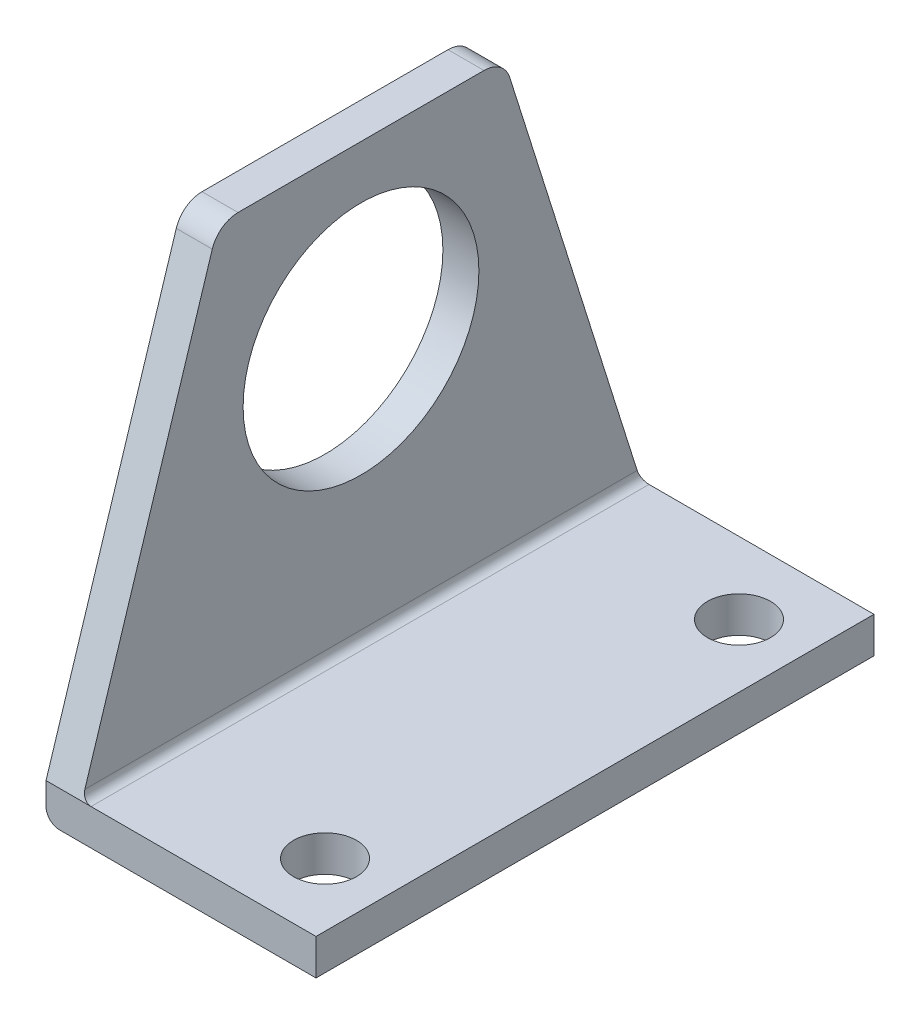
ISO-10303-21;
HEADER;
FILE_DESCRIPTION(('STEP AP214'),'2;1');
FILE_NAME('part.step','',(''),(''),'','','');
FILE_SCHEMA(('AUTOMOTIVE_DESIGN { 1 0 10303 214 1 1 1 1 }'));
ENDSEC;
DATA;
#1=APPLICATION_CONTEXT('core data for automotive mechanical design processes');
#2=APPLICATION_PROTOCOL_DEFINITION('international standard','automotive_design',2000,#1);
#3=PRODUCT_CONTEXT('',#1,'mechanical');
#4=PRODUCT('Part','Part','',(#3));
#5=PRODUCT_RELATED_PRODUCT_CATEGORY('part','',(#4));
#6=PRODUCT_DEFINITION_FORMATION('','',#4);
#7=PRODUCT_DEFINITION_CONTEXT('part definition',#1,'design');
#8=PRODUCT_DEFINITION('design','',#6,#7);
#9=PRODUCT_DEFINITION_SHAPE('','',#8);
#10=(LENGTH_UNIT() NAMED_UNIT(*) SI_UNIT(.MILLI.,.METRE.));
#11=(NAMED_UNIT(*) PLANE_ANGLE_UNIT() SI_UNIT($,.RADIAN.));
#12=(NAMED_UNIT(*) SI_UNIT($,.STERADIAN.) SOLID_ANGLE_UNIT());
#13=UNCERTAINTY_MEASURE_WITH_UNIT(LENGTH_MEASURE(1.E-05),#10,'distance_accuracy_value','');
#14=(GEOMETRIC_REPRESENTATION_CONTEXT(3) GLOBAL_UNCERTAINTY_ASSIGNED_CONTEXT((#13)) GLOBAL_UNIT_ASSIGNED_CONTEXT((#10,
#11,#12)) REPRESENTATION_CONTEXT('',''));
#15=CARTESIAN_POINT('',(0.,0.,0.));
#16=DIRECTION('',(0.,0.,1.));
#17=DIRECTION('',(1.,0.,0.));
#18=AXIS2_PLACEMENT_3D('',#15,#16,#17);
#19=CARTESIAN_POINT('',(0.,49.,-13.6659671250233));
#20=DIRECTION('',(1.,0.,0.));
#21=DIRECTION('',(0.,0.,-1.));
#22=AXIS2_PLACEMENT_3D('',#19,#20,#21);
#23=PLANE('',#22);
#24=CARTESIAN_POINT('',(0.,33.,0.));
#25=DIRECTION('',(1.,0.,0.));
#26=DIRECTION('',(0.,0.,-1.));
#27=AXIS2_PLACEMENT_3D('',#24,#25,#26);
#28=CIRCLE('',#27,13.1);
#29=CARTESIAN_POINT('',(0.,33.,-13.1));
#30=VERTEX_POINT('',#29);
#31=EDGE_CURVE('E176',#30,#30,#28,.T.);
#32=ORIENTED_EDGE('',*,*,#31,.T.);
#33=EDGE_LOOP('',(#32));
#34=FACE_BOUND('',#33,.T.);
#35=DIRECTION('',(0.,0.,1.));
#36=VECTOR('',#35,1.);
#37=CARTESIAN_POINT('',(0.,1.5,-31.));
#38=LINE('',#37,#36);
#39=CARTESIAN_POINT('',(0.,1.5,-31.));
#40=VERTEX_POINT('',#39);
#41=CARTESIAN_POINT('',(0.,1.5,31.));
#42=VERTEX_POINT('',#41);
#43=EDGE_CURVE('E52',#40,#42,#38,.T.);
#44=ORIENTED_EDGE('',*,*,#43,.T.);
#45=DIRECTION('',(0.,-1.,0.));
#46=VECTOR('',#45,1.);
#47=CARTESIAN_POINT('',(0.,4.,31.));
#48=LINE('',#47,#46);
#49=CARTESIAN_POINT('',(0.,4.,31.));
#50=VERTEX_POINT('',#49);
#51=EDGE_CURVE('E133',#50,#42,#48,.T.);
#52=ORIENTED_EDGE('',*,*,#51,.F.);
#53=DIRECTION('',(0.,-0.953716950748227,0.300705799504273));
#54=VECTOR('',#53,1.);
#55=CARTESIAN_POINT('',(0.,49.9021173985128,16.527117977268));
#56=LINE('',#55,#54);
#57=CARTESIAN_POINT('',(0.,49.9021173985128,16.527117977268));
#58=VERTEX_POINT('',#57);
#59=EDGE_CURVE('E181',#58,#50,#56,.T.);
#60=ORIENTED_EDGE('',*,*,#59,.F.);
#61=CARTESIAN_POINT('',(0.,49.,13.6659671250233));
#62=DIRECTION('',(1.,0.,0.));
#63=DIRECTION('',(0.,0.,-1.));
#64=AXIS2_PLACEMENT_3D('',#61,#62,#63);
#65=CIRCLE('',#64,3.);
#66=CARTESIAN_POINT('',(0.,52.,13.6659671250233));
#67=VERTEX_POINT('',#66);
#68=EDGE_CURVE('E199',#67,#58,#65,.T.);
#69=ORIENTED_EDGE('',*,*,#68,.F.);
#70=DIRECTION('',(0.,0.,1.));
#71=VECTOR('',#70,1.);
#72=CARTESIAN_POINT('',(0.,52.,-13.6659671250233));
#73=LINE('',#72,#71);
#74=CARTESIAN_POINT('',(0.,52.,-13.6659671250233));
#75=VERTEX_POINT('',#74);
#76=EDGE_CURVE('E196',#75,#67,#73,.T.);
#77=ORIENTED_EDGE('',*,*,#76,.F.);
#78=CARTESIAN_POINT('',(0.,49.,-13.6659671250233));
#79=DIRECTION('',(1.,0.,0.));
#80=DIRECTION('',(0.,0.,-1.));
#81=AXIS2_PLACEMENT_3D('',#78,#79,#80);
#82=CIRCLE('',#81,3.00000000000002);
#83=CARTESIAN_POINT('',(0.,49.9021173985128,-16.527117977268));
#84=VERTEX_POINT('',#83);
#85=EDGE_CURVE('E193',#84,#75,#82,.T.);
#86=ORIENTED_EDGE('',*,*,#85,.F.);
#87=DIRECTION('',(0.,0.953716950748227,0.300705799504273));
#88=VECTOR('',#87,1.);
#89=CARTESIAN_POINT('',(0.,4.,-31.));
#90=LINE('',#89,#88);
#91=CARTESIAN_POINT('',(0.,4.,-31.));
#92=VERTEX_POINT('',#91);
#93=EDGE_CURVE('E190',#92,#84,#90,.T.);
#94=ORIENTED_EDGE('',*,*,#93,.F.);
#95=DIRECTION('',(0.,1.,0.));
#96=VECTOR('',#95,1.);
#97=CARTESIAN_POINT('',(0.,0.,-31.));
#98=LINE('',#97,#96);
#99=EDGE_CURVE('E188',#40,#92,#98,.T.);
#100=ORIENTED_EDGE('',*,*,#99,.F.);
#101=EDGE_LOOP('',(#44,#52,#60,#69,#77,#86,#94,#100));
#102=FACE_BOUND('',#101,.T.);
#103=ADVANCED_FACE('F37',(#34,#102),#23,.F.);
#104=CARTESIAN_POINT('',(30.,49.,-13.6659671250233));
#105=DIRECTION('',(1.,0.,0.));
#106=DIRECTION('',(0.,0.,-1.));
#107=AXIS2_PLACEMENT_3D('',#104,#105,#106);
#108=PLANE('',#107);
#109=DIRECTION('',(0.,0.,1.));
#110=VECTOR('',#109,1.);
#111=CARTESIAN_POINT('',(30.,4.,-31.));
#112=LINE('',#111,#110);
#113=CARTESIAN_POINT('',(30.,4.,-31.));
#114=VERTEX_POINT('',#113);
#115=CARTESIAN_POINT('',(30.,4.,31.));
#116=VERTEX_POINT('',#115);
#117=EDGE_CURVE('E158',#114,#116,#112,.T.);
#118=ORIENTED_EDGE('',*,*,#117,.T.);
#119=DIRECTION('',(0.,-1.,0.));
#120=VECTOR('',#119,1.);
#121=CARTESIAN_POINT('',(30.,4.,31.));
#122=LINE('',#121,#120);
#123=CARTESIAN_POINT('',(30.,0.,31.));
#124=VERTEX_POINT('',#123);
#125=EDGE_CURVE('E179',#116,#124,#122,.T.);
#126=ORIENTED_EDGE('',*,*,#125,.T.);
#127=DIRECTION('',(0.,0.,-1.));
#128=VECTOR('',#127,1.);
#129=CARTESIAN_POINT('',(30.,0.,31.));
#130=LINE('',#129,#128);
#131=CARTESIAN_POINT('',(30.,0.,-31.));
#132=VERTEX_POINT('',#131);
#133=EDGE_CURVE('E137',#124,#132,#130,.T.);
#134=ORIENTED_EDGE('',*,*,#133,.T.);
#135=DIRECTION('',(0.,1.,0.));
#136=VECTOR('',#135,1.);
#137=CARTESIAN_POINT('',(30.,0.,-31.));
#138=LINE('',#137,#136);
#139=EDGE_CURVE('E183',#132,#114,#138,.T.);
#140=ORIENTED_EDGE('',*,*,#139,.T.);
#141=EDGE_LOOP('',(#118,#126,#134,#140));
#142=FACE_BOUND('',#141,.T.);
#143=ADVANCED_FACE('F244',(#142),#108,.T.);
#144=CARTESIAN_POINT('',(30.,4.,31.));
#145=DIRECTION('',(0.,0.,-1.));
#146=DIRECTION('',(-1.,0.,0.));
#147=AXIS2_PLACEMENT_3D('',#144,#145,#146);
#148=PLANE('',#147);
#149=ORIENTED_EDGE('',*,*,#51,.T.);
#150=CARTESIAN_POINT('',(1.5,1.5,31.));
#151=DIRECTION('',(0.,0.,-1.));
#152=DIRECTION('',(-1.,0.,0.));
#153=AXIS2_PLACEMENT_3D('',#150,#151,#152);
#154=CIRCLE('',#153,1.5);
#155=CARTESIAN_POINT('',(1.5,0.,31.));
#156=VERTEX_POINT('',#155);
#157=EDGE_CURVE('E121',#156,#42,#154,.T.);
#158=ORIENTED_EDGE('',*,*,#157,.F.);
#159=DIRECTION('',(-1.,0.,0.));
#160=VECTOR('',#159,1.);
#161=CARTESIAN_POINT('',(30.,0.,31.));
#162=LINE('',#161,#160);
#163=EDGE_CURVE('E45',#124,#156,#162,.T.);
#164=ORIENTED_EDGE('',*,*,#163,.F.);
#165=ORIENTED_EDGE('',*,*,#125,.F.);
#166=DIRECTION('',(-1.,0.,0.));
#167=VECTOR('',#166,1.);
#168=CARTESIAN_POINT('',(30.,4.,31.));
#169=LINE('',#168,#167);
#170=CARTESIAN_POINT('',(5.,4.,31.));
#171=VERTEX_POINT('',#170);
#172=EDGE_CURVE('E204',#116,#171,#169,.T.);
#173=ORIENTED_EDGE('',*,*,#172,.T.);
#174=EDGE_CURVE('E186',#171,#50,#169,.T.);
#175=ORIENTED_EDGE('',*,*,#174,.T.);
#176=EDGE_LOOP('',(#149,#158,#164,#165,#173,#175));
#177=FACE_BOUND('',#176,.T.);
#178=ADVANCED_FACE('F39',(#177),#148,.F.);
#179=CARTESIAN_POINT('',(30.,0.,31.));
#180=DIRECTION('',(0.,1.,0.));
#181=DIRECTION('',(0.,0.,1.));
#182=AXIS2_PLACEMENT_3D('',#179,#180,#181);
#183=PLANE('',#182);
#184=CARTESIAN_POINT('',(23.,0.,23.));
#185=DIRECTION('',(0.,1.,0.));
#186=DIRECTION('',(0.,0.,1.));
#187=AXIS2_PLACEMENT_3D('',#184,#185,#186);
#188=CIRCLE('',#187,3.5);
#189=CARTESIAN_POINT('',(23.,0.,26.5));
#190=VERTEX_POINT('',#189);
#191=EDGE_CURVE('E433',#190,#190,#188,.T.);
#192=ORIENTED_EDGE('',*,*,#191,.T.);
#193=EDGE_LOOP('',(#192));
#194=FACE_BOUND('',#193,.T.);
#195=CARTESIAN_POINT('',(23.,0.,-23.));
#196=DIRECTION('',(0.,1.,0.));
#197=DIRECTION('',(0.,0.,1.));
#198=AXIS2_PLACEMENT_3D('',#195,#196,#197);
#199=CIRCLE('',#198,3.5);
#200=CARTESIAN_POINT('',(23.,0.,-19.5));
#201=VERTEX_POINT('',#200);
#202=EDGE_CURVE('E134',#201,#201,#199,.T.);
#203=ORIENTED_EDGE('',*,*,#202,.T.);
#204=EDGE_LOOP('',(#203));
#205=FACE_BOUND('',#204,.T.);
#206=ORIENTED_EDGE('',*,*,#163,.T.);
#207=DIRECTION('',(0.,0.,1.));
#208=VECTOR('',#207,1.);
#209=CARTESIAN_POINT('',(1.5,0.,-31.));
#210=LINE('',#209,#208);
#211=CARTESIAN_POINT('',(1.5,0.,-31.));
#212=VERTEX_POINT('',#211);
#213=EDGE_CURVE('E118',#212,#156,#210,.T.);
#214=ORIENTED_EDGE('',*,*,#213,.F.);
#215=DIRECTION('',(-1.,0.,0.));
#216=VECTOR('',#215,1.);
#217=CARTESIAN_POINT('',(30.,0.,-31.));
#218=LINE('',#217,#216);
#219=EDGE_CURVE('E139',#132,#212,#218,.T.);
#220=ORIENTED_EDGE('',*,*,#219,.F.);
#221=ORIENTED_EDGE('',*,*,#133,.F.);
#222=EDGE_LOOP('',(#206,#214,#220,#221));
#223=FACE_BOUND('',#222,.T.);
#224=ADVANCED_FACE('F136',(#194,#205,#223),#183,.F.);
#225=CARTESIAN_POINT('',(30.,0.,-31.));
#226=DIRECTION('',(0.,0.,1.));
#227=DIRECTION('',(1.,0.,0.));
#228=AXIS2_PLACEMENT_3D('',#225,#226,#227);
#229=PLANE('',#228);
#230=ORIENTED_EDGE('',*,*,#219,.T.);
#231=CARTESIAN_POINT('',(1.5,1.5,-31.));
#232=DIRECTION('',(0.,0.,-1.));
#233=DIRECTION('',(-1.,0.,0.));
#234=AXIS2_PLACEMENT_3D('',#231,#232,#233);
#235=CIRCLE('',#234,1.5);
#236=EDGE_CURVE('E122',#212,#40,#235,.T.);
#237=ORIENTED_EDGE('',*,*,#236,.T.);
#238=ORIENTED_EDGE('',*,*,#99,.T.);
#239=DIRECTION('',(-1.,0.,0.));
#240=VECTOR('',#239,1.);
#241=CARTESIAN_POINT('',(30.,4.,-31.));
#242=LINE('',#241,#240);
#243=CARTESIAN_POINT('',(5.,4.,-31.));
#244=VERTEX_POINT('',#243);
#245=EDGE_CURVE('E214',#244,#92,#242,.T.);
#246=ORIENTED_EDGE('',*,*,#245,.F.);
#247=EDGE_CURVE('E141',#114,#244,#242,.T.);
#248=ORIENTED_EDGE('',*,*,#247,.F.);
#249=ORIENTED_EDGE('',*,*,#139,.F.);
#250=EDGE_LOOP('',(#230,#237,#238,#246,#248,#249));
#251=FACE_BOUND('',#250,.T.);
#252=ADVANCED_FACE('F246',(#251),#229,.F.);
#253=CARTESIAN_POINT('',(30.,4.,-31.));
#254=DIRECTION('',(0.,-0.300705799504273,0.953716950748227));
#255=DIRECTION('',(0.,-0.953716950748227,-0.300705799504273));
#256=AXIS2_PLACEMENT_3D('',#253,#254,#255);
#257=PLANE('',#256);
#258=DIRECTION('',(0.,-0.953716950748227,-0.300705799504273));
#259=VECTOR('',#258,1.);
#260=CARTESIAN_POINT('',(4.,4.,-31.));
#261=LINE('',#260,#259);
#262=CARTESIAN_POINT('',(4.,49.9021173985128,-16.527117977268));
#263=VERTEX_POINT('',#262);
#264=CARTESIAN_POINT('',(4.,5.,-30.684701211121));
#265=VERTEX_POINT('',#264);
#266=EDGE_CURVE('E170',#263,#265,#261,.T.);
#267=ORIENTED_EDGE('',*,*,#266,.T.);
#268=CARTESIAN_POINT('',(5.,5.,-30.684701211121));
#269=DIRECTION('',(0.,-0.300705799504273,0.953716950748227));
#270=DIRECTION('',(0.,0.953716950748227,0.300705799504273));
#271=AXIS2_PLACEMENT_3D('',#268,#269,#270);
#272=ELLIPSE('',#271,1.04852912514081,1.);
#273=EDGE_CURVE('E173',#265,#244,#272,.T.);
#274=ORIENTED_EDGE('',*,*,#273,.T.);
#275=ORIENTED_EDGE('',*,*,#245,.T.);
#276=ORIENTED_EDGE('',*,*,#93,.T.);
#277=DIRECTION('',(-1.,0.,0.));
#278=VECTOR('',#277,1.);
#279=CARTESIAN_POINT('',(30.,49.9021173985128,-16.527117977268));
#280=LINE('',#279,#278);
#281=EDGE_CURVE('E213',#263,#84,#280,.T.);
#282=ORIENTED_EDGE('',*,*,#281,.F.);
#283=EDGE_LOOP('',(#267,#274,#275,#276,#282));
#284=FACE_BOUND('',#283,.T.);
#285=ADVANCED_FACE('F220',(#284),#257,.F.);
#286=CARTESIAN_POINT('',(30.,49.,-13.6659671250233));
#287=DIRECTION('',(-1.,0.,0.));
#288=DIRECTION('',(0.,0.,1.));
#289=AXIS2_PLACEMENT_3D('',#286,#287,#288);
#290=CYLINDRICAL_SURFACE('',#289,3.00000000000002);
#291=DIRECTION('',(-1.,0.,0.));
#292=VECTOR('',#291,1.);
#293=CARTESIAN_POINT('',(30.,52.,-13.6659671250233));
#294=LINE('',#293,#292);
#295=CARTESIAN_POINT('',(4.,52.,-13.6659671250233));
#296=VERTEX_POINT('',#295);
#297=EDGE_CURVE('E211',#296,#75,#294,.T.);
#298=ORIENTED_EDGE('',*,*,#297,.F.);
#299=CARTESIAN_POINT('',(4.,49.,-13.6659671250233));
#300=DIRECTION('',(-1.,0.,0.));
#301=DIRECTION('',(0.,0.,1.));
#302=AXIS2_PLACEMENT_3D('',#299,#300,#301);
#303=CIRCLE('',#302,3.00000000000002);
#304=EDGE_CURVE('E167',#296,#263,#303,.T.);
#305=ORIENTED_EDGE('',*,*,#304,.T.);
#306=ORIENTED_EDGE('',*,*,#281,.T.);
#307=ORIENTED_EDGE('',*,*,#85,.T.);
#308=EDGE_LOOP('',(#298,#305,#306,#307));
#309=FACE_BOUND('',#308,.T.);
#310=ADVANCED_FACE('F230',(#309),#290,.T.);
#311=CARTESIAN_POINT('',(30.,52.,-13.6659671250233));
#312=DIRECTION('',(0.,-1.,0.));
#313=DIRECTION('',(0.,0.,-1.));
#314=AXIS2_PLACEMENT_3D('',#311,#312,#313);
#315=PLANE('',#314);
#316=DIRECTION('',(-1.,0.,0.));
#317=VECTOR('',#316,1.);
#318=CARTESIAN_POINT('',(30.,52.,13.6659671250233));
#319=LINE('',#318,#317);
#320=CARTESIAN_POINT('',(4.,52.,13.6659671250233));
#321=VERTEX_POINT('',#320);
#322=EDGE_CURVE('E209',#321,#67,#319,.T.);
#323=ORIENTED_EDGE('',*,*,#322,.F.);
#324=DIRECTION('',(0.,0.,1.));
#325=VECTOR('',#324,1.);
#326=CARTESIAN_POINT('',(4.,52.,-31.));
#327=LINE('',#326,#325);
#328=EDGE_CURVE('E154',#296,#321,#327,.T.);
#329=ORIENTED_EDGE('',*,*,#328,.F.);
#330=ORIENTED_EDGE('',*,*,#297,.T.);
#331=ORIENTED_EDGE('',*,*,#76,.T.);
#332=EDGE_LOOP('',(#323,#329,#330,#331));
#333=FACE_BOUND('',#332,.T.);
#334=ADVANCED_FACE('F269',(#333),#315,.F.);
#335=CARTESIAN_POINT('',(30.,49.,13.6659671250233));
#336=DIRECTION('',(-1.,0.,0.));
#337=DIRECTION('',(0.,0.,1.));
#338=AXIS2_PLACEMENT_3D('',#335,#336,#337);
#339=CYLINDRICAL_SURFACE('',#338,3.);
#340=DIRECTION('',(-1.,0.,0.));
#341=VECTOR('',#340,1.);
#342=CARTESIAN_POINT('',(30.,49.9021173985128,16.527117977268));
#343=LINE('',#342,#341);
#344=CARTESIAN_POINT('',(4.,49.9021173985128,16.527117977268));
#345=VERTEX_POINT('',#344);
#346=EDGE_CURVE('E207',#345,#58,#343,.T.);
#347=ORIENTED_EDGE('',*,*,#346,.F.);
#348=CARTESIAN_POINT('',(4.,49.,13.6659671250233));
#349=DIRECTION('',(-1.,0.,0.));
#350=DIRECTION('',(0.,0.,1.));
#351=AXIS2_PLACEMENT_3D('',#348,#349,#350);
#352=CIRCLE('',#351,3.);
#353=EDGE_CURVE('E151',#345,#321,#352,.T.);
#354=ORIENTED_EDGE('',*,*,#353,.T.);
#355=ORIENTED_EDGE('',*,*,#322,.T.);
#356=ORIENTED_EDGE('',*,*,#68,.T.);
#357=EDGE_LOOP('',(#347,#354,#355,#356));
#358=FACE_BOUND('',#357,.T.);
#359=ADVANCED_FACE('F239',(#358),#339,.T.);
#360=CARTESIAN_POINT('',(30.,49.9021173985128,16.527117977268));
#361=DIRECTION('',(0.,-0.300705799504273,-0.953716950748227));
#362=DIRECTION('',(0.,0.953716950748227,-0.300705799504273));
#363=AXIS2_PLACEMENT_3D('',#360,#361,#362);
#364=PLANE('',#363);
#365=ORIENTED_EDGE('',*,*,#174,.F.);
#366=CARTESIAN_POINT('',(5.,5.,30.684701211121));
#367=DIRECTION('',(0.,-0.300705799504273,-0.953716950748227));
#368=DIRECTION('',(0.,-0.953716950748227,0.300705799504273));
#369=AXIS2_PLACEMENT_3D('',#366,#367,#368);
#370=ELLIPSE('',#369,1.04852912514081,1.);
#371=CARTESIAN_POINT('',(4.,5.,30.684701211121));
#372=VERTEX_POINT('',#371);
#373=EDGE_CURVE('E11',#171,#372,#370,.T.);
#374=ORIENTED_EDGE('',*,*,#373,.T.);
#375=DIRECTION('',(0.,0.953716950748227,-0.300705799504273));
#376=VECTOR('',#375,1.);
#377=CARTESIAN_POINT('',(4.,49.9021173985128,16.527117977268));
#378=LINE('',#377,#376);
#379=EDGE_CURVE('E146',#372,#345,#378,.T.);
#380=ORIENTED_EDGE('',*,*,#379,.T.);
#381=ORIENTED_EDGE('',*,*,#346,.T.);
#382=ORIENTED_EDGE('',*,*,#59,.T.);
#383=EDGE_LOOP('',(#365,#374,#380,#381,#382));
#384=FACE_BOUND('',#383,.T.);
#385=ADVANCED_FACE('F237',(#384),#364,.F.);
#386=CARTESIAN_POINT('',(30.,33.,0.));
#387=DIRECTION('',(-1.,0.,0.));
#388=DIRECTION('',(0.,0.,1.));
#389=AXIS2_PLACEMENT_3D('',#386,#387,#388);
#390=CYLINDRICAL_SURFACE('',#389,13.1);
#391=CARTESIAN_POINT('',(4.,33.,0.));
#392=DIRECTION('',(-1.,0.,0.));
#393=DIRECTION('',(0.,0.,1.));
#394=AXIS2_PLACEMENT_3D('',#391,#392,#393);
#395=CIRCLE('',#394,13.1);
#396=CARTESIAN_POINT('',(4.,33.,13.1));
#397=VERTEX_POINT('',#396);
#398=EDGE_CURVE('E144',#397,#397,#395,.T.);
#399=ORIENTED_EDGE('',*,*,#398,.F.);
#400=EDGE_LOOP('',(#399));
#401=FACE_BOUND('',#400,.T.);
#402=ORIENTED_EDGE('',*,*,#31,.F.);
#403=EDGE_LOOP('',(#402));
#404=FACE_BOUND('',#403,.T.);
#405=ADVANCED_FACE('F266',(#401,#404),#390,.F.);
#406=CARTESIAN_POINT('',(5.,5.,-31.));
#407=DIRECTION('',(0.,0.,1.));
#408=DIRECTION('',(1.,0.,0.));
#409=AXIS2_PLACEMENT_3D('',#406,#407,#408);
#410=CYLINDRICAL_SURFACE('',#409,1.);
#411=DIRECTION('',(0.,0.,1.));
#412=VECTOR('',#411,1.);
#413=CARTESIAN_POINT('',(4.,5.,-31.));
#414=LINE('',#413,#412);
#415=EDGE_CURVE('E147',#265,#372,#414,.T.);
#416=ORIENTED_EDGE('',*,*,#415,.T.);
#417=ORIENTED_EDGE('',*,*,#373,.F.);
#418=DIRECTION('',(0.,0.,1.));
#419=VECTOR('',#418,1.);
#420=CARTESIAN_POINT('',(5.,4.,-31.));
#421=LINE('',#420,#419);
#422=EDGE_CURVE('E60',#244,#171,#421,.T.);
#423=ORIENTED_EDGE('',*,*,#422,.F.);
#424=ORIENTED_EDGE('',*,*,#273,.F.);
#425=EDGE_LOOP('',(#416,#417,#423,#424));
#426=FACE_BOUND('',#425,.T.);
#427=ADVANCED_FACE('F298',(#426),#410,.F.);
#428=CARTESIAN_POINT('',(4.,52.,-31.));
#429=DIRECTION('',(-1.,0.,0.));
#430=DIRECTION('',(0.,0.,1.));
#431=AXIS2_PLACEMENT_3D('',#428,#429,#430);
#432=PLANE('',#431);
#433=ORIENTED_EDGE('',*,*,#398,.T.);
#434=EDGE_LOOP('',(#433));
#435=FACE_BOUND('',#434,.T.);
#436=ORIENTED_EDGE('',*,*,#304,.F.);
#437=ORIENTED_EDGE('',*,*,#328,.T.);
#438=ORIENTED_EDGE('',*,*,#353,.F.);
#439=ORIENTED_EDGE('',*,*,#379,.F.);
#440=ORIENTED_EDGE('',*,*,#415,.F.);
#441=ORIENTED_EDGE('',*,*,#266,.F.);
#442=EDGE_LOOP('',(#436,#437,#438,#439,#440,#441));
#443=FACE_BOUND('',#442,.T.);
#444=ADVANCED_FACE('F232',(#435,#443),#432,.F.);
#445=CARTESIAN_POINT('',(5.,4.,-31.));
#446=DIRECTION('',(0.,-1.,0.));
#447=DIRECTION('',(0.,0.,-1.));
#448=AXIS2_PLACEMENT_3D('',#445,#446,#447);
#449=PLANE('',#448);
#450=CARTESIAN_POINT('',(23.,4.,23.));
#451=DIRECTION('',(0.,1.,0.));
#452=DIRECTION('',(0.,0.,1.));
#453=AXIS2_PLACEMENT_3D('',#450,#451,#452);
#454=CIRCLE('',#453,3.5);
#455=CARTESIAN_POINT('',(23.,4.,26.5));
#456=VERTEX_POINT('',#455);
#457=EDGE_CURVE('E430',#456,#456,#454,.T.);
#458=ORIENTED_EDGE('',*,*,#457,.F.);
#459=EDGE_LOOP('',(#458));
#460=FACE_BOUND('',#459,.T.);
#461=CARTESIAN_POINT('',(23.,4.,-23.));
#462=DIRECTION('',(0.,1.,0.));
#463=DIRECTION('',(0.,0.,1.));
#464=AXIS2_PLACEMENT_3D('',#461,#462,#463);
#465=CIRCLE('',#464,3.5);
#466=CARTESIAN_POINT('',(23.,4.,-19.5));
#467=VERTEX_POINT('',#466);
#468=EDGE_CURVE('E434',#467,#467,#465,.T.);
#469=ORIENTED_EDGE('',*,*,#468,.F.);
#470=EDGE_LOOP('',(#469));
#471=FACE_BOUND('',#470,.T.);
#472=ORIENTED_EDGE('',*,*,#117,.F.);
#473=ORIENTED_EDGE('',*,*,#247,.T.);
#474=ORIENTED_EDGE('',*,*,#422,.T.);
#475=ORIENTED_EDGE('',*,*,#172,.F.);
#476=EDGE_LOOP('',(#472,#473,#474,#475));
#477=FACE_BOUND('',#476,.T.);
#478=ADVANCED_FACE('F242',(#460,#471,#477),#449,.F.);
#479=CARTESIAN_POINT('',(1.5,1.5,-31.));
#480=DIRECTION('',(0.,0.,1.));
#481=DIRECTION('',(1.,0.,0.));
#482=AXIS2_PLACEMENT_3D('',#479,#480,#481);
#483=CYLINDRICAL_SURFACE('',#482,1.5);
#484=ORIENTED_EDGE('',*,*,#43,.F.);
#485=ORIENTED_EDGE('',*,*,#236,.F.);
#486=ORIENTED_EDGE('',*,*,#213,.T.);
#487=ORIENTED_EDGE('',*,*,#157,.T.);
#488=EDGE_LOOP('',(#484,#485,#486,#487));
#489=FACE_BOUND('',#488,.T.);
#490=ADVANCED_FACE('F120',(#489),#483,.T.);
#491=CARTESIAN_POINT('',(23.,-4.,-23.));
#492=DIRECTION('',(0.,1.,0.));
#493=DIRECTION('',(0.,0.,1.));
#494=AXIS2_PLACEMENT_3D('',#491,#492,#493);
#495=CYLINDRICAL_SURFACE('',#494,3.5);
#496=ORIENTED_EDGE('',*,*,#468,.T.);
#497=EDGE_LOOP('',(#496));
#498=FACE_BOUND('',#497,.T.);
#499=ORIENTED_EDGE('',*,*,#202,.F.);
#500=EDGE_LOOP('',(#499));
#501=FACE_BOUND('',#500,.T.);
#502=ADVANCED_FACE('F322',(#498,#501),#495,.F.);
#503=CARTESIAN_POINT('',(23.,-4.,23.));
#504=DIRECTION('',(0.,1.,0.));
#505=DIRECTION('',(0.,0.,1.));
#506=AXIS2_PLACEMENT_3D('',#503,#504,#505);
#507=CYLINDRICAL_SURFACE('',#506,3.5);
#508=ORIENTED_EDGE('',*,*,#457,.T.);
#509=EDGE_LOOP('',(#508));
#510=FACE_BOUND('',#509,.T.);
#511=ORIENTED_EDGE('',*,*,#191,.F.);
#512=EDGE_LOOP('',(#511));
#513=FACE_BOUND('',#512,.T.);
#514=ADVANCED_FACE('F329',(#510,#513),#507,.F.);
#515=CLOSED_SHELL('',(#103,#143,#178,#224,#252,#285,#310,#334,#359,#385,#405,#427,#444,#478,
#490,#502,#514));
#516=MANIFOLD_SOLID_BREP('B2',#515);
#517=ADVANCED_BREP_SHAPE_REPRESENTATION('',(#18,#516),#14);
#518=SHAPE_DEFINITION_REPRESENTATION(#9,#517);
ENDSEC;
END-ISO-10303-21;
